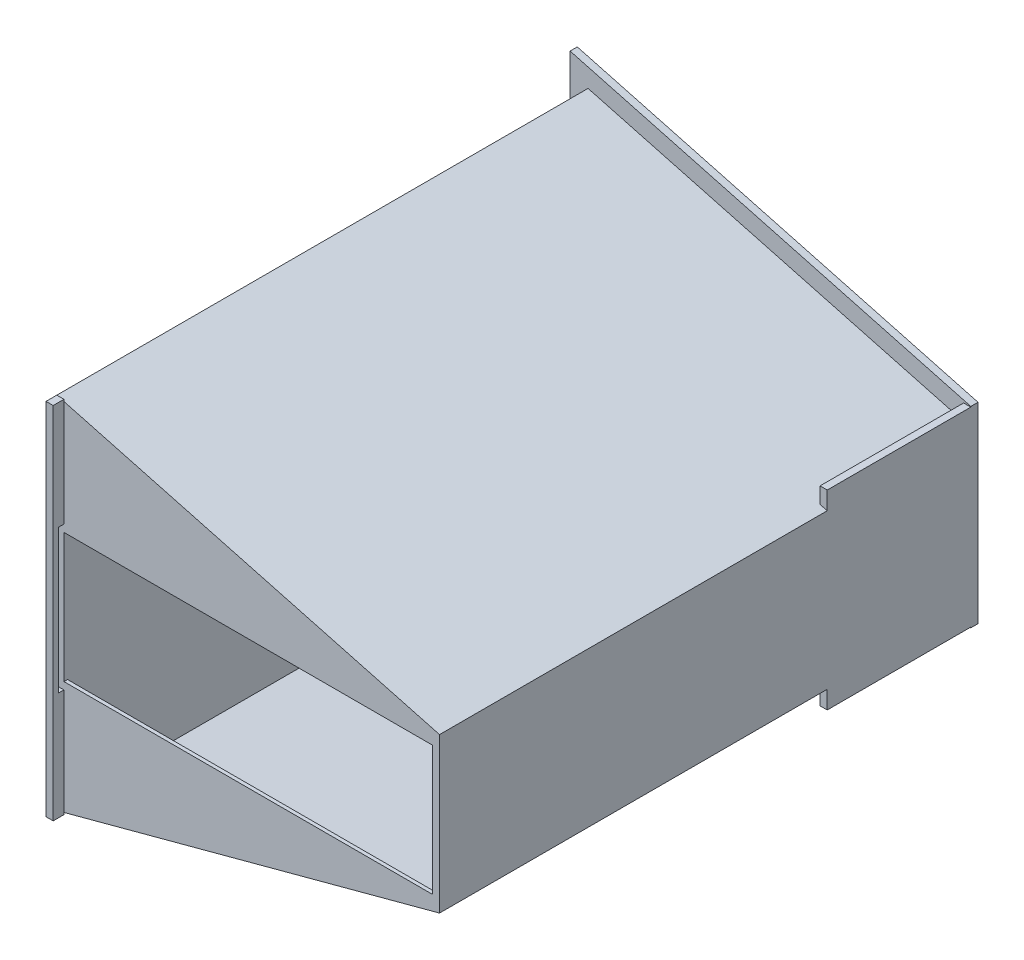
ISO-10303-21;
HEADER;
FILE_DESCRIPTION(('STEP AP214'),'2;1');
FILE_NAME('part.step','',(''),(''),'','','');
FILE_SCHEMA(('AUTOMOTIVE_DESIGN { 1 0 10303 214 1 1 1 1 }'));
ENDSEC;
DATA;
#1=APPLICATION_CONTEXT('core data for automotive mechanical design processes');
#2=APPLICATION_PROTOCOL_DEFINITION('international standard','automotive_design',2000,#1);
#3=PRODUCT_CONTEXT('',#1,'mechanical');
#4=PRODUCT('Part','Part','',(#3));
#5=PRODUCT_RELATED_PRODUCT_CATEGORY('part','',(#4));
#6=PRODUCT_DEFINITION_FORMATION('','',#4);
#7=PRODUCT_DEFINITION_CONTEXT('part definition',#1,'design');
#8=PRODUCT_DEFINITION('design','',#6,#7);
#9=PRODUCT_DEFINITION_SHAPE('','',#8);
#10=(LENGTH_UNIT() NAMED_UNIT(*) SI_UNIT(.MILLI.,.METRE.));
#11=(NAMED_UNIT(*) PLANE_ANGLE_UNIT() SI_UNIT($,.RADIAN.));
#12=(NAMED_UNIT(*) SI_UNIT($,.STERADIAN.) SOLID_ANGLE_UNIT());
#13=UNCERTAINTY_MEASURE_WITH_UNIT(LENGTH_MEASURE(1.E-05),#10,'distance_accuracy_value','');
#14=(GEOMETRIC_REPRESENTATION_CONTEXT(3) GLOBAL_UNCERTAINTY_ASSIGNED_CONTEXT((#13)) GLOBAL_UNIT_ASSIGNED_CONTEXT((#10,
#11,#12)) REPRESENTATION_CONTEXT('',''));
#15=CARTESIAN_POINT('',(0.,0.,0.));
#16=DIRECTION('',(0.,0.,1.));
#17=DIRECTION('',(1.,0.,0.));
#18=AXIS2_PLACEMENT_3D('',#15,#16,#17);
#19=CARTESIAN_POINT('',(24.2679246792882,90.5678949031037,150.));
#20=DIRECTION('',(-0.258822332634395,-0.965924945391561,0.));
#21=DIRECTION('',(0.965924945391561,-0.258822332634395,0.));
#22=AXIS2_PLACEMENT_3D('',#19,#20,#21);
#23=PLANE('',#22);
#24=DIRECTION('',(0.,0.,-1.));
#25=VECTOR('',#24,1.);
#26=CARTESIAN_POINT('',(104.63,69.0346485685079,150.));
#27=LINE('',#26,#25);
#28=CARTESIAN_POINT('',(104.63,69.0346485685079,150.));
#29=VERTEX_POINT('',#28);
#30=CARTESIAN_POINT('',(104.63,69.0346485685079,42.));
#31=VERTEX_POINT('',#30);
#32=EDGE_CURVE('E452',#29,#31,#27,.T.);
#33=ORIENTED_EDGE('',*,*,#32,.T.);
#34=DIRECTION('',(-0.965924945391561,0.258822332634395,0.));
#35=VECTOR('',#34,1.);
#36=CARTESIAN_POINT('',(24.2679246792883,90.5678949031037,42.));
#37=LINE('',#36,#35);
#38=CARTESIAN_POINT('',(102.63,69.5705542491081,42.));
#39=VERTEX_POINT('',#38);
#40=EDGE_CURVE('E286',#31,#39,#37,.T.);
#41=ORIENTED_EDGE('',*,*,#40,.T.);
#42=DIRECTION('',(0.,0.,-1.));
#43=VECTOR('',#42,1.);
#44=CARTESIAN_POINT('',(102.63,69.5705542491081,150.));
#45=LINE('',#44,#43);
#46=CARTESIAN_POINT('',(102.63,69.5705542491081,2.));
#47=VERTEX_POINT('',#46);
#48=EDGE_CURVE('E282',#39,#47,#45,.T.);
#49=ORIENTED_EDGE('',*,*,#48,.T.);
#50=DIRECTION('',(-0.965924945391561,0.258822332634395,0.));
#51=VECTOR('',#50,1.);
#52=CARTESIAN_POINT('',(-2.00000000000001,97.6064599297083,2.));
#53=LINE('',#52,#51);
#54=CARTESIAN_POINT('',(-2.00000000000001,97.6064599297083,2.));
#55=VERTEX_POINT('',#54);
#56=EDGE_CURVE('E58',#47,#55,#53,.T.);
#57=ORIENTED_EDGE('',*,*,#56,.T.);
#58=DIRECTION('',(0.,0.,-1.));
#59=VECTOR('',#58,1.);
#60=CARTESIAN_POINT('',(-2.00000000000001,97.6064599297083,150.));
#61=LINE('',#60,#59);
#62=CARTESIAN_POINT('',(-2.00000000000001,97.6064599297083,150.));
#63=VERTEX_POINT('',#62);
#64=EDGE_CURVE('E450',#63,#55,#61,.T.);
#65=ORIENTED_EDGE('',*,*,#64,.F.);
#66=DIRECTION('',(0.965924945391561,-0.258822332634395,0.));
#67=VECTOR('',#66,1.);
#68=CARTESIAN_POINT('',(24.2679246792882,90.5678949031037,150.));
#69=LINE('',#68,#67);
#70=CARTESIAN_POINT('',(0.,97.0705542491081,150.));
#71=VERTEX_POINT('',#70);
#72=EDGE_CURVE('E374',#63,#71,#69,.T.);
#73=ORIENTED_EDGE('',*,*,#72,.T.);
#74=DIRECTION('',(-0.965924945391561,0.258822332634395,0.));
#75=VECTOR('',#74,1.);
#76=CARTESIAN_POINT('',(24.2679246792882,90.5678949031037,150.));
#77=LINE('',#76,#75);
#78=EDGE_CURVE('E421',#29,#71,#77,.T.);
#79=ORIENTED_EDGE('',*,*,#78,.F.);
#80=EDGE_LOOP('',(#33,#41,#49,#57,#65,#73,#79));
#81=FACE_BOUND('',#80,.T.);
#82=ADVANCED_FACE('F35',(#81),#23,.F.);
#83=CARTESIAN_POINT('',(-1.99999999999999,0.,150.));
#84=DIRECTION('',(1.,0.,0.));
#85=DIRECTION('',(0.,1.,0.));
#86=AXIS2_PLACEMENT_3D('',#83,#84,#85);
#87=PLANE('',#86);
#88=DIRECTION('',(0.,0.,-1.));
#89=VECTOR('',#88,1.);
#90=CARTESIAN_POINT('',(-1.99999999999999,27.5,151.5));
#91=LINE('',#90,#89);
#92=CARTESIAN_POINT('',(-1.99999999999999,27.5,151.5));
#93=VERTEX_POINT('',#92);
#94=CARTESIAN_POINT('',(-2.,27.5,150.));
#95=VERTEX_POINT('',#94);
#96=EDGE_CURVE('E368',#93,#95,#91,.T.);
#97=ORIENTED_EDGE('',*,*,#96,.T.);
#98=DIRECTION('',(0.,-1.,0.));
#99=VECTOR('',#98,1.);
#100=CARTESIAN_POINT('',(-1.99999999999999,0.,150.));
#101=LINE('',#100,#99);
#102=CARTESIAN_POINT('',(-1.99999999999999,67.5,150.));
#103=VERTEX_POINT('',#102);
#104=EDGE_CURVE('E424',#103,#95,#101,.T.);
#105=ORIENTED_EDGE('',*,*,#104,.F.);
#106=DIRECTION('',(0.,0.,1.));
#107=VECTOR('',#106,1.);
#108=CARTESIAN_POINT('',(-1.99999999999999,67.5,150.));
#109=LINE('',#108,#107);
#110=CARTESIAN_POINT('',(-1.99999999999999,67.5,151.5));
#111=VERTEX_POINT('',#110);
#112=EDGE_CURVE('E362',#103,#111,#109,.T.);
#113=ORIENTED_EDGE('',*,*,#112,.T.);
#114=DIRECTION('',(0.,-1.,0.));
#115=VECTOR('',#114,1.);
#116=CARTESIAN_POINT('',(-1.99999999999999,67.5,151.5));
#117=LINE('',#116,#115);
#118=EDGE_CURVE('E365',#111,#93,#117,.T.);
#119=ORIENTED_EDGE('',*,*,#118,.T.);
#120=EDGE_LOOP('',(#97,#105,#113,#119));
#121=FACE_BOUND('',#120,.T.);
#122=DIRECTION('',(0.,-1.,0.));
#123=VECTOR('',#122,1.);
#124=CARTESIAN_POINT('',(-1.99999999999999,-2.60645992970831,2.));
#125=LINE('',#124,#123);
#126=CARTESIAN_POINT('',(-1.99999999999999,-2.60645992970831,2.));
#127=VERTEX_POINT('',#126);
#128=EDGE_CURVE('E291',#55,#127,#125,.T.);
#129=ORIENTED_EDGE('',*,*,#128,.T.);
#130=DIRECTION('',(0.,0.,-1.));
#131=VECTOR('',#130,1.);
#132=CARTESIAN_POINT('',(-1.99999999999999,-2.60645992970831,150.));
#133=LINE('',#132,#131);
#134=CARTESIAN_POINT('',(-1.99999999999999,-2.60645992970831,150.));
#135=VERTEX_POINT('',#134);
#136=EDGE_CURVE('E446',#135,#127,#133,.T.);
#137=ORIENTED_EDGE('',*,*,#136,.F.);
#138=DIRECTION('',(0.,0.,1.));
#139=VECTOR('',#138,1.);
#140=CARTESIAN_POINT('',(-1.99999999999999,-2.60645992970831,150.));
#141=LINE('',#140,#139);
#142=CARTESIAN_POINT('',(-1.99999999999999,-2.60645992970831,153.));
#143=VERTEX_POINT('',#142);
#144=EDGE_CURVE('E320',#135,#143,#141,.T.);
#145=ORIENTED_EDGE('',*,*,#144,.T.);
#146=DIRECTION('',(0.,1.,0.));
#147=VECTOR('',#146,1.);
#148=CARTESIAN_POINT('',(-1.99999999999999,-2.60645992970831,153.));
#149=LINE('',#148,#147);
#150=CARTESIAN_POINT('',(-1.99999999999999,97.6064599297083,153.));
#151=VERTEX_POINT('',#150);
#152=EDGE_CURVE('E356',#143,#151,#149,.T.);
#153=ORIENTED_EDGE('',*,*,#152,.T.);
#154=DIRECTION('',(0.,0.,-1.));
#155=VECTOR('',#154,1.);
#156=CARTESIAN_POINT('',(-1.99999999999999,97.6064599297083,153.));
#157=LINE('',#156,#155);
#158=EDGE_CURVE('E359',#151,#63,#157,.T.);
#159=ORIENTED_EDGE('',*,*,#158,.T.);
#160=ORIENTED_EDGE('',*,*,#64,.T.);
#161=EDGE_LOOP('',(#129,#137,#145,#153,#159,#160));
#162=FACE_BOUND('',#161,.T.);
#163=ADVANCED_FACE('F521',(#121,#162),#87,.F.);
#164=CARTESIAN_POINT('',(0.51764466526879,-1.93184989078312,150.));
#165=DIRECTION('',(-0.258822332634395,0.965924945391561,0.));
#166=DIRECTION('',(-0.965924945391561,-0.258822332634395,0.));
#167=AXIS2_PLACEMENT_3D('',#164,#165,#166);
#168=PLANE('',#167);
#169=DIRECTION('',(0.,0.,-1.));
#170=VECTOR('',#169,1.);
#171=CARTESIAN_POINT('',(102.63,25.4294457508919,150.));
#172=LINE('',#171,#170);
#173=CARTESIAN_POINT('',(102.63,25.4294457508919,42.));
#174=VERTEX_POINT('',#173);
#175=CARTESIAN_POINT('',(102.63,25.4294457508919,2.));
#176=VERTEX_POINT('',#175);
#177=EDGE_CURVE('E240',#174,#176,#172,.T.);
#178=ORIENTED_EDGE('',*,*,#177,.F.);
#179=DIRECTION('',(0.965924945391561,0.258822332634395,0.));
#180=VECTOR('',#179,1.);
#181=CARTESIAN_POINT('',(0.517644665268827,-1.93184989078311,42.));
#182=LINE('',#181,#180);
#183=CARTESIAN_POINT('',(104.63,25.9653514314921,42.));
#184=VERTEX_POINT('',#183);
#185=EDGE_CURVE('E264',#174,#184,#182,.T.);
#186=ORIENTED_EDGE('',*,*,#185,.T.);
#187=DIRECTION('',(0.,0.,-1.));
#188=VECTOR('',#187,1.);
#189=CARTESIAN_POINT('',(104.63,25.9653514314921,150.));
#190=LINE('',#189,#188);
#191=CARTESIAN_POINT('',(104.63,25.9653514314921,150.));
#192=VERTEX_POINT('',#191);
#193=EDGE_CURVE('E443',#192,#184,#190,.T.);
#194=ORIENTED_EDGE('',*,*,#193,.F.);
#195=DIRECTION('',(0.965924945391561,0.258822332634395,0.));
#196=VECTOR('',#195,1.);
#197=CARTESIAN_POINT('',(0.51764466526879,-1.93184989078312,150.));
#198=LINE('',#197,#196);
#199=CARTESIAN_POINT('',(0.,-2.07055424910809,150.));
#200=VERTEX_POINT('',#199);
#201=EDGE_CURVE('E426',#200,#192,#198,.T.);
#202=ORIENTED_EDGE('',*,*,#201,.F.);
#203=EDGE_CURVE('E427',#135,#200,#198,.T.);
#204=ORIENTED_EDGE('',*,*,#203,.F.);
#205=ORIENTED_EDGE('',*,*,#136,.T.);
#206=DIRECTION('',(0.965924945391561,0.258822332634395,0.));
#207=VECTOR('',#206,1.);
#208=CARTESIAN_POINT('',(104.63,25.9653514314921,2.));
#209=LINE('',#208,#207);
#210=EDGE_CURVE('E294',#127,#176,#209,.T.);
#211=ORIENTED_EDGE('',*,*,#210,.T.);
#212=EDGE_LOOP('',(#178,#186,#194,#202,#204,#205,#211));
#213=FACE_BOUND('',#212,.T.);
#214=ADVANCED_FACE('F514',(#213),#168,.F.);
#215=CARTESIAN_POINT('',(102.63,0.,150.));
#216=DIRECTION('',(-1.,0.,0.));
#217=DIRECTION('',(0.,0.,1.));
#218=AXIS2_PLACEMENT_3D('',#215,#216,#217);
#219=PLANE('',#218);
#220=DIRECTION('',(0.,-1.,0.));
#221=VECTOR('',#220,1.);
#222=CARTESIAN_POINT('',(102.63,0.,149.));
#223=LINE('',#222,#221);
#224=CARTESIAN_POINT('',(102.63,29.5,149.));
#225=VERTEX_POINT('',#224);
#226=CARTESIAN_POINT('',(102.63,27.5,149.));
#227=VERTEX_POINT('',#226);
#228=EDGE_CURVE('E402',#225,#227,#223,.T.);
#229=ORIENTED_EDGE('',*,*,#228,.F.);
#230=DIRECTION('',(0.,0.,1.));
#231=VECTOR('',#230,1.);
#232=CARTESIAN_POINT('',(102.63,29.5,149.));
#233=LINE('',#232,#231);
#234=CARTESIAN_POINT('',(102.63,29.5,150.));
#235=VERTEX_POINT('',#234);
#236=EDGE_CURVE('E408',#225,#235,#233,.T.);
#237=ORIENTED_EDGE('',*,*,#236,.T.);
#238=DIRECTION('',(0.,1.,0.));
#239=VECTOR('',#238,1.);
#240=CARTESIAN_POINT('',(102.63,0.,150.));
#241=LINE('',#240,#239);
#242=CARTESIAN_POINT('',(102.63,65.5,150.));
#243=VERTEX_POINT('',#242);
#244=EDGE_CURVE('E413',#235,#243,#241,.T.);
#245=ORIENTED_EDGE('',*,*,#244,.T.);
#246=DIRECTION('',(0.,0.,1.));
#247=VECTOR('',#246,1.);
#248=CARTESIAN_POINT('',(102.63,65.5,149.));
#249=LINE('',#248,#247);
#250=CARTESIAN_POINT('',(102.63,65.5,149.));
#251=VERTEX_POINT('',#250);
#252=EDGE_CURVE('E470',#251,#243,#249,.T.);
#253=ORIENTED_EDGE('',*,*,#252,.F.);
#254=DIRECTION('',(0.,-1.,0.));
#255=VECTOR('',#254,1.);
#256=CARTESIAN_POINT('',(102.63,0.,149.));
#257=LINE('',#256,#255);
#258=CARTESIAN_POINT('',(102.63,67.5,149.));
#259=VERTEX_POINT('',#258);
#260=EDGE_CURVE('E464',#259,#251,#257,.T.);
#261=ORIENTED_EDGE('',*,*,#260,.F.);
#262=DIRECTION('',(0.,0.,-1.));
#263=VECTOR('',#262,1.);
#264=CARTESIAN_POINT('',(102.63,67.5,150.));
#265=LINE('',#264,#263);
#266=CARTESIAN_POINT('',(102.63,67.5,0.));
#267=VERTEX_POINT('',#266);
#268=EDGE_CURVE('E447',#259,#267,#265,.T.);
#269=ORIENTED_EDGE('',*,*,#268,.T.);
#270=DIRECTION('',(0.,1.,0.));
#271=VECTOR('',#270,1.);
#272=CARTESIAN_POINT('',(102.63,0.,0.));
#273=LINE('',#272,#271);
#274=CARTESIAN_POINT('',(102.63,27.5,0.));
#275=VERTEX_POINT('',#274);
#276=EDGE_CURVE('E433',#275,#267,#273,.T.);
#277=ORIENTED_EDGE('',*,*,#276,.F.);
#278=DIRECTION('',(0.,0.,-1.));
#279=VECTOR('',#278,1.);
#280=CARTESIAN_POINT('',(102.63,27.5,150.));
#281=LINE('',#280,#279);
#282=EDGE_CURVE('E459',#227,#275,#281,.T.);
#283=ORIENTED_EDGE('',*,*,#282,.F.);
#284=EDGE_LOOP('',(#229,#237,#245,#253,#261,#269,#277,#283));
#285=FACE_BOUND('',#284,.T.);
#286=ADVANCED_FACE('F512',(#285),#219,.T.);
#287=CARTESIAN_POINT('',(0.,0.,150.));
#288=DIRECTION('',(1.,0.,0.));
#289=DIRECTION('',(0.,0.,-1.));
#290=AXIS2_PLACEMENT_3D('',#287,#288,#289);
#291=PLANE('',#290);
#292=DIRECTION('',(0.,-1.,0.));
#293=VECTOR('',#292,1.);
#294=CARTESIAN_POINT('',(0.,0.,150.));
#295=LINE('',#294,#293);
#296=CARTESIAN_POINT('',(0.,65.5,150.));
#297=VERTEX_POINT('',#296);
#298=CARTESIAN_POINT('',(0.,29.5,150.));
#299=VERTEX_POINT('',#298);
#300=EDGE_CURVE('E415',#297,#299,#295,.T.);
#301=ORIENTED_EDGE('',*,*,#300,.T.);
#302=DIRECTION('',(0.,0.,1.));
#303=VECTOR('',#302,1.);
#304=CARTESIAN_POINT('',(0.,29.5,149.));
#305=LINE('',#304,#303);
#306=CARTESIAN_POINT('',(0.,29.5,149.));
#307=VERTEX_POINT('',#306);
#308=EDGE_CURVE('E405',#307,#299,#305,.T.);
#309=ORIENTED_EDGE('',*,*,#308,.F.);
#310=DIRECTION('',(0.,1.,0.));
#311=VECTOR('',#310,1.);
#312=CARTESIAN_POINT('',(0.,0.,149.));
#313=LINE('',#312,#311);
#314=CARTESIAN_POINT('',(0.,0.,149.));
#315=VERTEX_POINT('',#314);
#316=EDGE_CURVE('E396',#315,#307,#313,.T.);
#317=ORIENTED_EDGE('',*,*,#316,.F.);
#318=DIRECTION('',(0.,0.,-1.));
#319=VECTOR('',#318,1.);
#320=CARTESIAN_POINT('',(0.,0.,150.));
#321=LINE('',#320,#319);
#322=CARTESIAN_POINT('',(0.,0.,0.));
#323=VERTEX_POINT('',#322);
#324=EDGE_CURVE('E457',#315,#323,#321,.T.);
#325=ORIENTED_EDGE('',*,*,#324,.T.);
#326=DIRECTION('',(0.,-1.,0.));
#327=VECTOR('',#326,1.);
#328=CARTESIAN_POINT('',(0.,0.,0.));
#329=LINE('',#328,#327);
#330=CARTESIAN_POINT('',(0.,95.,0.));
#331=VERTEX_POINT('',#330);
#332=EDGE_CURVE('E439',#331,#323,#329,.T.);
#333=ORIENTED_EDGE('',*,*,#332,.F.);
#334=DIRECTION('',(0.,0.,-1.));
#335=VECTOR('',#334,1.);
#336=CARTESIAN_POINT('',(0.,95.,150.));
#337=LINE('',#336,#335);
#338=CARTESIAN_POINT('',(0.,95.,149.));
#339=VERTEX_POINT('',#338);
#340=EDGE_CURVE('E430',#339,#331,#337,.T.);
#341=ORIENTED_EDGE('',*,*,#340,.F.);
#342=DIRECTION('',(0.,1.,0.));
#343=VECTOR('',#342,1.);
#344=CARTESIAN_POINT('',(0.,0.,149.));
#345=LINE('',#344,#343);
#346=CARTESIAN_POINT('',(0.,65.5,149.));
#347=VERTEX_POINT('',#346);
#348=EDGE_CURVE('E468',#347,#339,#345,.T.);
#349=ORIENTED_EDGE('',*,*,#348,.F.);
#350=DIRECTION('',(0.,0.,1.));
#351=VECTOR('',#350,1.);
#352=CARTESIAN_POINT('',(0.,65.5,149.));
#353=LINE('',#352,#351);
#354=EDGE_CURVE('E43',#347,#297,#353,.T.);
#355=ORIENTED_EDGE('',*,*,#354,.T.);
#356=EDGE_LOOP('',(#301,#309,#317,#325,#333,#341,#349,#355));
#357=FACE_BOUND('',#356,.T.);
#358=ADVANCED_FACE('F487',(#357),#291,.T.);
#359=CARTESIAN_POINT('',(0.,0.,150.));
#360=DIRECTION('',(-0.258822332634395,0.965924945391561,0.));
#361=DIRECTION('',(-0.965924945391561,-0.258822332634395,0.));
#362=AXIS2_PLACEMENT_3D('',#359,#360,#361);
#363=PLANE('',#362);
#364=ORIENTED_EDGE('',*,*,#324,.F.);
#365=DIRECTION('',(-0.965924945391561,-0.258822332634395,0.));
#366=VECTOR('',#365,1.);
#367=CARTESIAN_POINT('',(0.,0.,149.));
#368=LINE('',#367,#366);
#369=EDGE_CURVE('E399',#227,#315,#368,.T.);
#370=ORIENTED_EDGE('',*,*,#369,.F.);
#371=ORIENTED_EDGE('',*,*,#282,.T.);
#372=DIRECTION('',(0.965924945391561,0.258822332634395,0.));
#373=VECTOR('',#372,1.);
#374=CARTESIAN_POINT('',(0.,0.,0.));
#375=LINE('',#374,#373);
#376=EDGE_CURVE('E436',#323,#275,#375,.T.);
#377=ORIENTED_EDGE('',*,*,#376,.F.);
#378=EDGE_LOOP('',(#364,#370,#371,#377));
#379=FACE_BOUND('',#378,.T.);
#380=ADVANCED_FACE('F499',(#379),#363,.T.);
#381=CARTESIAN_POINT('',(0.,65.5,149.));
#382=DIRECTION('',(0.,1.,0.));
#383=DIRECTION('',(-1.,0.,0.));
#384=AXIS2_PLACEMENT_3D('',#381,#382,#383);
#385=PLANE('',#384);
#386=DIRECTION('',(-1.,0.,0.));
#387=VECTOR('',#386,1.);
#388=CARTESIAN_POINT('',(0.,65.5,150.));
#389=LINE('',#388,#387);
#390=EDGE_CURVE('E455',#243,#297,#389,.T.);
#391=ORIENTED_EDGE('',*,*,#390,.T.);
#392=ORIENTED_EDGE('',*,*,#354,.F.);
#393=DIRECTION('',(-1.,0.,0.));
#394=VECTOR('',#393,1.);
#395=CARTESIAN_POINT('',(0.,65.5,149.));
#396=LINE('',#395,#394);
#397=EDGE_CURVE('E462',#251,#347,#396,.T.);
#398=ORIENTED_EDGE('',*,*,#397,.F.);
#399=ORIENTED_EDGE('',*,*,#252,.T.);
#400=EDGE_LOOP('',(#391,#392,#398,#399));
#401=FACE_BOUND('',#400,.T.);
#402=ADVANCED_FACE('F37',(#401),#385,.F.);
#403=CARTESIAN_POINT('',(0.,0.,149.));
#404=DIRECTION('',(0.,0.,1.));
#405=DIRECTION('',(1.,0.,0.));
#406=AXIS2_PLACEMENT_3D('',#403,#404,#405);
#407=PLANE('',#406);
#408=ORIENTED_EDGE('',*,*,#397,.T.);
#409=ORIENTED_EDGE('',*,*,#348,.T.);
#410=DIRECTION('',(0.965924945391561,-0.258822332634395,0.));
#411=VECTOR('',#410,1.);
#412=CARTESIAN_POINT('',(23.7502800140195,88.6360450123206,149.));
#413=LINE('',#412,#411);
#414=EDGE_CURVE('E466',#339,#259,#413,.T.);
#415=ORIENTED_EDGE('',*,*,#414,.T.);
#416=ORIENTED_EDGE('',*,*,#260,.T.);
#417=EDGE_LOOP('',(#408,#409,#415,#416));
#418=FACE_BOUND('',#417,.T.);
#419=ADVANCED_FACE('F511',(#418),#407,.F.);
#420=CARTESIAN_POINT('',(0.,0.,150.));
#421=DIRECTION('',(0.,0.,1.));
#422=DIRECTION('',(1.,0.,0.));
#423=AXIS2_PLACEMENT_3D('',#420,#421,#422);
#424=PLANE('',#423);
#425=DIRECTION('',(-1.,0.,0.));
#426=VECTOR('',#425,1.);
#427=CARTESIAN_POINT('',(0.,67.5,150.));
#428=LINE('',#427,#426);
#429=CARTESIAN_POINT('',(0.,67.5,150.));
#430=VERTEX_POINT('',#429);
#431=EDGE_CURVE('E379',#430,#103,#428,.T.);
#432=ORIENTED_EDGE('',*,*,#431,.T.);
#433=ORIENTED_EDGE('',*,*,#104,.T.);
#434=DIRECTION('',(-1.,0.,0.));
#435=VECTOR('',#434,1.);
#436=CARTESIAN_POINT('',(0.,27.5,150.));
#437=LINE('',#436,#435);
#438=CARTESIAN_POINT('',(0.,27.5,150.));
#439=VERTEX_POINT('',#438);
#440=EDGE_CURVE('E371',#439,#95,#437,.T.);
#441=ORIENTED_EDGE('',*,*,#440,.F.);
#442=DIRECTION('',(0.,-1.,0.));
#443=VECTOR('',#442,1.);
#444=CARTESIAN_POINT('',(0.,27.5,150.));
#445=LINE('',#444,#443);
#446=EDGE_CURVE('E327',#439,#200,#445,.T.);
#447=ORIENTED_EDGE('',*,*,#446,.T.);
#448=ORIENTED_EDGE('',*,*,#201,.T.);
#449=DIRECTION('',(0.,1.,0.));
#450=VECTOR('',#449,1.);
#451=CARTESIAN_POINT('',(104.63,0.,150.));
#452=LINE('',#451,#450);
#453=EDGE_CURVE('E418',#192,#29,#452,.T.);
#454=ORIENTED_EDGE('',*,*,#453,.T.);
#455=ORIENTED_EDGE('',*,*,#78,.T.);
#456=DIRECTION('',(0.,-1.,0.));
#457=VECTOR('',#456,1.);
#458=CARTESIAN_POINT('',(0.,97.6064599297083,150.));
#459=LINE('',#458,#457);
#460=EDGE_CURVE('E340',#71,#430,#459,.T.);
#461=ORIENTED_EDGE('',*,*,#460,.T.);
#462=EDGE_LOOP('',(#432,#433,#441,#447,#448,#454,#455,#461));
#463=FACE_BOUND('',#462,.T.);
#464=ORIENTED_EDGE('',*,*,#244,.F.);
#465=DIRECTION('',(1.,0.,0.));
#466=VECTOR('',#465,1.);
#467=CARTESIAN_POINT('',(0.,29.5,150.));
#468=LINE('',#467,#466);
#469=EDGE_CURVE('E392',#299,#235,#468,.T.);
#470=ORIENTED_EDGE('',*,*,#469,.F.);
#471=ORIENTED_EDGE('',*,*,#300,.F.);
#472=ORIENTED_EDGE('',*,*,#390,.F.);
#473=EDGE_LOOP('',(#464,#470,#471,#472));
#474=FACE_BOUND('',#473,.T.);
#475=ADVANCED_FACE('F484',(#463,#474),#424,.T.);
#476=CARTESIAN_POINT('',(23.7502800140195,88.6360450123206,150.));
#477=DIRECTION('',(-0.258822332634395,-0.965924945391561,0.));
#478=DIRECTION('',(0.965924945391561,-0.258822332634395,0.));
#479=AXIS2_PLACEMENT_3D('',#476,#477,#478);
#480=PLANE('',#479);
#481=ORIENTED_EDGE('',*,*,#414,.F.);
#482=ORIENTED_EDGE('',*,*,#340,.T.);
#483=DIRECTION('',(-0.965924945391561,0.258822332634395,0.));
#484=VECTOR('',#483,1.);
#485=CARTESIAN_POINT('',(23.7502800140195,88.6360450123206,0.));
#486=LINE('',#485,#484);
#487=EDGE_CURVE('E410',#267,#331,#486,.T.);
#488=ORIENTED_EDGE('',*,*,#487,.F.);
#489=ORIENTED_EDGE('',*,*,#268,.F.);
#490=EDGE_LOOP('',(#481,#482,#488,#489));
#491=FACE_BOUND('',#490,.T.);
#492=ADVANCED_FACE('F508',(#491),#480,.T.);
#493=CARTESIAN_POINT('',(104.63,0.,150.));
#494=DIRECTION('',(-1.,0.,0.));
#495=DIRECTION('',(0.,0.,1.));
#496=AXIS2_PLACEMENT_3D('',#493,#494,#495);
#497=PLANE('',#496);
#498=ORIENTED_EDGE('',*,*,#193,.T.);
#499=DIRECTION('',(0.,-1.,0.));
#500=VECTOR('',#499,1.);
#501=CARTESIAN_POINT('',(104.63,25.9653514314921,42.));
#502=LINE('',#501,#500);
#503=CARTESIAN_POINT('',(104.63,20.9653514314921,42.));
#504=VERTEX_POINT('',#503);
#505=EDGE_CURVE('E253',#184,#504,#502,.T.);
#506=ORIENTED_EDGE('',*,*,#505,.T.);
#507=DIRECTION('',(0.,0.,-1.));
#508=VECTOR('',#507,1.);
#509=CARTESIAN_POINT('',(104.63,20.9653514314921,42.));
#510=LINE('',#509,#508);
#511=CARTESIAN_POINT('',(104.63,20.9653514314921,2.));
#512=VERTEX_POINT('',#511);
#513=EDGE_CURVE('E50',#504,#512,#510,.T.);
#514=ORIENTED_EDGE('',*,*,#513,.T.);
#515=DIRECTION('',(0.,-1.,0.));
#516=VECTOR('',#515,1.);
#517=CARTESIAN_POINT('',(104.63,25.9653514314921,2.));
#518=LINE('',#517,#516);
#519=CARTESIAN_POINT('',(104.63,20.7889658087219,2.));
#520=VERTEX_POINT('',#519);
#521=EDGE_CURVE('E257',#512,#520,#518,.T.);
#522=ORIENTED_EDGE('',*,*,#521,.T.);
#523=DIRECTION('',(0.,0.,-1.));
#524=VECTOR('',#523,1.);
#525=CARTESIAN_POINT('',(104.63,20.7889658087219,2.));
#526=LINE('',#525,#524);
#527=CARTESIAN_POINT('',(104.63,20.7889658087219,0.));
#528=VERTEX_POINT('',#527);
#529=EDGE_CURVE('E309',#520,#528,#526,.T.);
#530=ORIENTED_EDGE('',*,*,#529,.T.);
#531=DIRECTION('',(0.,1.,0.));
#532=VECTOR('',#531,1.);
#533=CARTESIAN_POINT('',(104.63,0.,0.));
#534=LINE('',#533,#532);
#535=CARTESIAN_POINT('',(104.63,74.2110341912781,0.));
#536=VERTEX_POINT('',#535);
#537=EDGE_CURVE('E416',#528,#536,#534,.T.);
#538=ORIENTED_EDGE('',*,*,#537,.T.);
#539=DIRECTION('',(0.,0.,-1.));
#540=VECTOR('',#539,1.);
#541=CARTESIAN_POINT('',(104.63,74.2110341912781,2.));
#542=LINE('',#541,#540);
#543=CARTESIAN_POINT('',(104.63,74.2110341912781,2.));
#544=VERTEX_POINT('',#543);
#545=EDGE_CURVE('E317',#544,#536,#542,.T.);
#546=ORIENTED_EDGE('',*,*,#545,.F.);
#547=DIRECTION('',(0.,-1.,0.));
#548=VECTOR('',#547,1.);
#549=CARTESIAN_POINT('',(104.63,74.2110341912781,2.));
#550=LINE('',#549,#548);
#551=CARTESIAN_POINT('',(104.63,74.0346485685079,2.));
#552=VERTEX_POINT('',#551);
#553=EDGE_CURVE('E306',#544,#552,#550,.T.);
#554=ORIENTED_EDGE('',*,*,#553,.T.);
#555=DIRECTION('',(0.,0.,1.));
#556=VECTOR('',#555,1.);
#557=CARTESIAN_POINT('',(104.63,74.0346485685079,42.));
#558=LINE('',#557,#556);
#559=CARTESIAN_POINT('',(104.63,74.0346485685079,42.));
#560=VERTEX_POINT('',#559);
#561=EDGE_CURVE('E267',#552,#560,#558,.T.);
#562=ORIENTED_EDGE('',*,*,#561,.T.);
#563=DIRECTION('',(0.,-1.,0.));
#564=VECTOR('',#563,1.);
#565=CARTESIAN_POINT('',(104.63,69.0346485685079,42.));
#566=LINE('',#565,#564);
#567=EDGE_CURVE('E272',#560,#31,#566,.T.);
#568=ORIENTED_EDGE('',*,*,#567,.T.);
#569=ORIENTED_EDGE('',*,*,#32,.F.);
#570=ORIENTED_EDGE('',*,*,#453,.F.);
#571=EDGE_LOOP('',(#498,#506,#514,#522,#530,#538,#546,#554,#562,#568,#569,#570));
#572=FACE_BOUND('',#571,.T.);
#573=ADVANCED_FACE('F534',(#572),#497,.F.);
#574=CARTESIAN_POINT('',(0.,0.,0.));
#575=DIRECTION('',(0.,0.,1.));
#576=DIRECTION('',(1.,0.,0.));
#577=AXIS2_PLACEMENT_3D('',#574,#575,#576);
#578=PLANE('',#577);
#579=ORIENTED_EDGE('',*,*,#537,.F.);
#580=DIRECTION('',(-0.965924945391561,-0.258822332634395,0.));
#581=VECTOR('',#580,1.);
#582=CARTESIAN_POINT('',(104.63,20.7889658087219,0.));
#583=LINE('',#582,#581);
#584=CARTESIAN_POINT('',(-6.99999999999999,-9.12260975397908,0.));
#585=VERTEX_POINT('',#584);
#586=EDGE_CURVE('E289',#528,#585,#583,.T.);
#587=ORIENTED_EDGE('',*,*,#586,.T.);
#588=DIRECTION('',(0.,1.,0.));
#589=VECTOR('',#588,1.);
#590=CARTESIAN_POINT('',(-6.99999999999999,-9.12260975397908,0.));
#591=LINE('',#590,#589);
#592=CARTESIAN_POINT('',(-6.99999999999999,104.122609753979,0.));
#593=VERTEX_POINT('',#592);
#594=EDGE_CURVE('E312',#585,#593,#591,.T.);
#595=ORIENTED_EDGE('',*,*,#594,.T.);
#596=DIRECTION('',(0.965924945391561,-0.258822332634395,0.));
#597=VECTOR('',#596,1.);
#598=CARTESIAN_POINT('',(-6.99999999999999,104.122609753979,0.));
#599=LINE('',#598,#597);
#600=EDGE_CURVE('E292',#593,#536,#599,.T.);
#601=ORIENTED_EDGE('',*,*,#600,.T.);
#602=EDGE_LOOP('',(#579,#587,#595,#601));
#603=FACE_BOUND('',#602,.T.);
#604=ORIENTED_EDGE('',*,*,#487,.T.);
#605=ORIENTED_EDGE('',*,*,#332,.T.);
#606=ORIENTED_EDGE('',*,*,#376,.T.);
#607=ORIENTED_EDGE('',*,*,#276,.T.);
#608=EDGE_LOOP('',(#604,#605,#606,#607));
#609=FACE_BOUND('',#608,.T.);
#610=ADVANCED_FACE('F503',(#603,#609),#578,.F.);
#611=CARTESIAN_POINT('',(0.,29.5,149.));
#612=DIRECTION('',(0.,-1.,0.));
#613=DIRECTION('',(0.,0.,-1.));
#614=AXIS2_PLACEMENT_3D('',#611,#612,#613);
#615=PLANE('',#614);
#616=ORIENTED_EDGE('',*,*,#469,.T.);
#617=ORIENTED_EDGE('',*,*,#236,.F.);
#618=DIRECTION('',(1.,0.,0.));
#619=VECTOR('',#618,1.);
#620=CARTESIAN_POINT('',(0.,29.5,149.));
#621=LINE('',#620,#619);
#622=EDGE_CURVE('E393',#307,#225,#621,.T.);
#623=ORIENTED_EDGE('',*,*,#622,.F.);
#624=ORIENTED_EDGE('',*,*,#308,.T.);
#625=EDGE_LOOP('',(#616,#617,#623,#624));
#626=FACE_BOUND('',#625,.T.);
#627=ADVANCED_FACE('F491',(#626),#615,.F.);
#628=CARTESIAN_POINT('',(0.,0.,149.));
#629=DIRECTION('',(0.,0.,1.));
#630=DIRECTION('',(1.,0.,0.));
#631=AXIS2_PLACEMENT_3D('',#628,#629,#630);
#632=PLANE('',#631);
#633=ORIENTED_EDGE('',*,*,#622,.T.);
#634=ORIENTED_EDGE('',*,*,#228,.T.);
#635=ORIENTED_EDGE('',*,*,#369,.T.);
#636=ORIENTED_EDGE('',*,*,#316,.T.);
#637=EDGE_LOOP('',(#633,#634,#635,#636));
#638=FACE_BOUND('',#637,.T.);
#639=ADVANCED_FACE('F494',(#638),#632,.F.);
#640=CARTESIAN_POINT('',(0.,97.6064599297083,150.));
#641=DIRECTION('',(0.,0.,-1.));
#642=DIRECTION('',(-1.,0.,0.));
#643=AXIS2_PLACEMENT_3D('',#640,#641,#642);
#644=PLANE('',#643);
#645=ORIENTED_EDGE('',*,*,#72,.F.);
#646=DIRECTION('',(-1.,0.,0.));
#647=VECTOR('',#646,1.);
#648=CARTESIAN_POINT('',(0.,97.6064599297083,150.));
#649=LINE('',#648,#647);
#650=CARTESIAN_POINT('',(0.,97.6064599297083,150.));
#651=VERTEX_POINT('',#650);
#652=EDGE_CURVE('E382',#651,#63,#649,.T.);
#653=ORIENTED_EDGE('',*,*,#652,.F.);
#654=EDGE_CURVE('E341',#651,#71,#459,.T.);
#655=ORIENTED_EDGE('',*,*,#654,.T.);
#656=EDGE_LOOP('',(#645,#653,#655));
#657=FACE_BOUND('',#656,.T.);
#658=ADVANCED_FACE('F580',(#657),#644,.T.);
#659=CARTESIAN_POINT('',(0.,27.5,150.));
#660=DIRECTION('',(0.,0.,-1.));
#661=DIRECTION('',(-1.,0.,0.));
#662=AXIS2_PLACEMENT_3D('',#659,#660,#661);
#663=PLANE('',#662);
#664=ORIENTED_EDGE('',*,*,#203,.T.);
#665=CARTESIAN_POINT('',(0.,-2.60645992970831,150.));
#666=VERTEX_POINT('',#665);
#667=EDGE_CURVE('E331',#200,#666,#445,.T.);
#668=ORIENTED_EDGE('',*,*,#667,.T.);
#669=DIRECTION('',(-1.,0.,0.));
#670=VECTOR('',#669,1.);
#671=CARTESIAN_POINT('',(0.,-2.60645992970831,150.));
#672=LINE('',#671,#670);
#673=EDGE_CURVE('E353',#666,#135,#672,.T.);
#674=ORIENTED_EDGE('',*,*,#673,.T.);
#675=EDGE_LOOP('',(#664,#668,#674));
#676=FACE_BOUND('',#675,.T.);
#677=ADVANCED_FACE('F587',(#676),#663,.T.);
#678=CARTESIAN_POINT('',(0.,27.5,151.5));
#679=DIRECTION('',(0.,1.,0.));
#680=DIRECTION('',(0.,0.,1.));
#681=AXIS2_PLACEMENT_3D('',#678,#679,#680);
#682=PLANE('',#681);
#683=ORIENTED_EDGE('',*,*,#96,.F.);
#684=DIRECTION('',(-1.,0.,0.));
#685=VECTOR('',#684,1.);
#686=CARTESIAN_POINT('',(0.,27.5,151.5));
#687=LINE('',#686,#685);
#688=CARTESIAN_POINT('',(0.,27.5,151.5));
#689=VERTEX_POINT('',#688);
#690=EDGE_CURVE('E375',#689,#93,#687,.T.);
#691=ORIENTED_EDGE('',*,*,#690,.F.);
#692=DIRECTION('',(0.,0.,-1.));
#693=VECTOR('',#692,1.);
#694=CARTESIAN_POINT('',(0.,27.5,151.5));
#695=LINE('',#694,#693);
#696=EDGE_CURVE('E350',#689,#439,#695,.T.);
#697=ORIENTED_EDGE('',*,*,#696,.T.);
#698=ORIENTED_EDGE('',*,*,#440,.T.);
#699=EDGE_LOOP('',(#683,#691,#697,#698));
#700=FACE_BOUND('',#699,.T.);
#701=ADVANCED_FACE('F595',(#700),#682,.T.);
#702=CARTESIAN_POINT('',(0.,67.5,151.5));
#703=DIRECTION('',(0.,0.,-1.));
#704=DIRECTION('',(-1.,0.,0.));
#705=AXIS2_PLACEMENT_3D('',#702,#703,#704);
#706=PLANE('',#705);
#707=ORIENTED_EDGE('',*,*,#118,.F.);
#708=DIRECTION('',(-1.,0.,0.));
#709=VECTOR('',#708,1.);
#710=CARTESIAN_POINT('',(0.,67.5,151.5));
#711=LINE('',#710,#709);
#712=CARTESIAN_POINT('',(0.,67.5,151.5));
#713=VERTEX_POINT('',#712);
#714=EDGE_CURVE('E377',#713,#111,#711,.T.);
#715=ORIENTED_EDGE('',*,*,#714,.F.);
#716=DIRECTION('',(0.,-1.,0.));
#717=VECTOR('',#716,1.);
#718=CARTESIAN_POINT('',(0.,67.5,151.5));
#719=LINE('',#718,#717);
#720=EDGE_CURVE('E347',#713,#689,#719,.T.);
#721=ORIENTED_EDGE('',*,*,#720,.T.);
#722=ORIENTED_EDGE('',*,*,#690,.T.);
#723=EDGE_LOOP('',(#707,#715,#721,#722));
#724=FACE_BOUND('',#723,.T.);
#725=ADVANCED_FACE('F603',(#724),#706,.T.);
#726=CARTESIAN_POINT('',(0.,67.5,150.));
#727=DIRECTION('',(0.,-1.,0.));
#728=DIRECTION('',(0.,0.,-1.));
#729=AXIS2_PLACEMENT_3D('',#726,#727,#728);
#730=PLANE('',#729);
#731=ORIENTED_EDGE('',*,*,#112,.F.);
#732=ORIENTED_EDGE('',*,*,#431,.F.);
#733=DIRECTION('',(0.,0.,1.));
#734=VECTOR('',#733,1.);
#735=CARTESIAN_POINT('',(0.,67.5,150.));
#736=LINE('',#735,#734);
#737=EDGE_CURVE('E344',#430,#713,#736,.T.);
#738=ORIENTED_EDGE('',*,*,#737,.T.);
#739=ORIENTED_EDGE('',*,*,#714,.T.);
#740=EDGE_LOOP('',(#731,#732,#738,#739));
#741=FACE_BOUND('',#740,.T.);
#742=ADVANCED_FACE('F611',(#741),#730,.T.);
#743=CARTESIAN_POINT('',(0.,97.6064599297083,153.));
#744=DIRECTION('',(0.,1.,0.));
#745=DIRECTION('',(0.,0.,1.));
#746=AXIS2_PLACEMENT_3D('',#743,#744,#745);
#747=PLANE('',#746);
#748=ORIENTED_EDGE('',*,*,#158,.F.);
#749=DIRECTION('',(-1.,0.,0.));
#750=VECTOR('',#749,1.);
#751=CARTESIAN_POINT('',(0.,97.6064599297083,153.));
#752=LINE('',#751,#750);
#753=CARTESIAN_POINT('',(0.,97.6064599297083,153.));
#754=VERTEX_POINT('',#753);
#755=EDGE_CURVE('E385',#754,#151,#752,.T.);
#756=ORIENTED_EDGE('',*,*,#755,.F.);
#757=DIRECTION('',(0.,0.,-1.));
#758=VECTOR('',#757,1.);
#759=CARTESIAN_POINT('',(0.,97.6064599297083,153.));
#760=LINE('',#759,#758);
#761=EDGE_CURVE('E337',#754,#651,#760,.T.);
#762=ORIENTED_EDGE('',*,*,#761,.T.);
#763=ORIENTED_EDGE('',*,*,#652,.T.);
#764=EDGE_LOOP('',(#748,#756,#762,#763));
#765=FACE_BOUND('',#764,.T.);
#766=ADVANCED_FACE('F619',(#765),#747,.T.);
#767=CARTESIAN_POINT('',(0.,-2.60645992970831,153.));
#768=DIRECTION('',(0.,0.,1.));
#769=DIRECTION('',(1.,0.,0.));
#770=AXIS2_PLACEMENT_3D('',#767,#768,#769);
#771=PLANE('',#770);
#772=ORIENTED_EDGE('',*,*,#152,.F.);
#773=DIRECTION('',(-1.,0.,0.));
#774=VECTOR('',#773,1.);
#775=CARTESIAN_POINT('',(0.,-2.60645992970831,153.));
#776=LINE('',#775,#774);
#777=CARTESIAN_POINT('',(0.,-2.60645992970831,153.));
#778=VERTEX_POINT('',#777);
#779=EDGE_CURVE('E387',#778,#143,#776,.T.);
#780=ORIENTED_EDGE('',*,*,#779,.F.);
#781=DIRECTION('',(0.,1.,0.));
#782=VECTOR('',#781,1.);
#783=CARTESIAN_POINT('',(0.,-2.60645992970831,153.));
#784=LINE('',#783,#782);
#785=EDGE_CURVE('E334',#778,#754,#784,.T.);
#786=ORIENTED_EDGE('',*,*,#785,.T.);
#787=ORIENTED_EDGE('',*,*,#755,.T.);
#788=EDGE_LOOP('',(#772,#780,#786,#787));
#789=FACE_BOUND('',#788,.T.);
#790=ADVANCED_FACE('F627',(#789),#771,.T.);
#791=CARTESIAN_POINT('',(0.,-2.60645992970831,150.));
#792=DIRECTION('',(0.,-1.,0.));
#793=DIRECTION('',(0.,0.,-1.));
#794=AXIS2_PLACEMENT_3D('',#791,#792,#793);
#795=PLANE('',#794);
#796=ORIENTED_EDGE('',*,*,#144,.F.);
#797=ORIENTED_EDGE('',*,*,#673,.F.);
#798=DIRECTION('',(0.,0.,1.));
#799=VECTOR('',#798,1.);
#800=CARTESIAN_POINT('',(0.,-2.60645992970831,150.));
#801=LINE('',#800,#799);
#802=EDGE_CURVE('E330',#666,#778,#801,.T.);
#803=ORIENTED_EDGE('',*,*,#802,.T.);
#804=ORIENTED_EDGE('',*,*,#779,.T.);
#805=EDGE_LOOP('',(#796,#797,#803,#804));
#806=FACE_BOUND('',#805,.T.);
#807=ADVANCED_FACE('F635',(#806),#795,.T.);
#808=CARTESIAN_POINT('',(0.,0.,0.));
#809=DIRECTION('',(-1.,0.,0.));
#810=DIRECTION('',(0.,0.,1.));
#811=AXIS2_PLACEMENT_3D('',#808,#809,#810);
#812=PLANE('',#811);
#813=ORIENTED_EDGE('',*,*,#446,.F.);
#814=ORIENTED_EDGE('',*,*,#696,.F.);
#815=ORIENTED_EDGE('',*,*,#720,.F.);
#816=ORIENTED_EDGE('',*,*,#737,.F.);
#817=ORIENTED_EDGE('',*,*,#460,.F.);
#818=ORIENTED_EDGE('',*,*,#654,.F.);
#819=ORIENTED_EDGE('',*,*,#761,.F.);
#820=ORIENTED_EDGE('',*,*,#785,.F.);
#821=ORIENTED_EDGE('',*,*,#802,.F.);
#822=ORIENTED_EDGE('',*,*,#667,.F.);
#823=EDGE_LOOP('',(#813,#814,#815,#816,#817,#818,#819,#820,#821,#822));
#824=FACE_BOUND('',#823,.T.);
#825=ADVANCED_FACE('F643',(#824),#812,.F.);
#826=CARTESIAN_POINT('',(-6.99999999999999,104.122609753979,2.));
#827=DIRECTION('',(0.258822332634395,0.965924945391561,0.));
#828=DIRECTION('',(-0.965924945391561,0.258822332634395,0.));
#829=AXIS2_PLACEMENT_3D('',#826,#827,#828);
#830=PLANE('',#829);
#831=ORIENTED_EDGE('',*,*,#600,.F.);
#832=DIRECTION('',(0.,0.,-1.));
#833=VECTOR('',#832,1.);
#834=CARTESIAN_POINT('',(-6.99999999999999,104.122609753979,2.));
#835=LINE('',#834,#833);
#836=CARTESIAN_POINT('',(-6.99999999999999,104.122609753979,2.));
#837=VERTEX_POINT('',#836);
#838=EDGE_CURVE('E321',#837,#593,#835,.T.);
#839=ORIENTED_EDGE('',*,*,#838,.F.);
#840=DIRECTION('',(0.965924945391561,-0.258822332634395,0.));
#841=VECTOR('',#840,1.);
#842=CARTESIAN_POINT('',(-6.99999999999999,104.122609753979,2.));
#843=LINE('',#842,#841);
#844=EDGE_CURVE('E303',#837,#544,#843,.T.);
#845=ORIENTED_EDGE('',*,*,#844,.T.);
#846=ORIENTED_EDGE('',*,*,#545,.T.);
#847=EDGE_LOOP('',(#831,#839,#845,#846));
#848=FACE_BOUND('',#847,.T.);
#849=ADVANCED_FACE('F651',(#848),#830,.T.);
#850=CARTESIAN_POINT('',(-6.99999999999999,-9.12260975397908,2.));
#851=DIRECTION('',(-1.,0.,0.));
#852=DIRECTION('',(0.,0.,1.));
#853=AXIS2_PLACEMENT_3D('',#850,#851,#852);
#854=PLANE('',#853);
#855=ORIENTED_EDGE('',*,*,#594,.F.);
#856=DIRECTION('',(0.,0.,-1.));
#857=VECTOR('',#856,1.);
#858=CARTESIAN_POINT('',(-6.99999999999999,-9.12260975397908,2.));
#859=LINE('',#858,#857);
#860=CARTESIAN_POINT('',(-6.99999999999999,-9.12260975397908,2.));
#861=VERTEX_POINT('',#860);
#862=EDGE_CURVE('E323',#861,#585,#859,.T.);
#863=ORIENTED_EDGE('',*,*,#862,.F.);
#864=DIRECTION('',(0.,1.,0.));
#865=VECTOR('',#864,1.);
#866=CARTESIAN_POINT('',(-6.99999999999999,-9.12260975397908,2.));
#867=LINE('',#866,#865);
#868=EDGE_CURVE('E300',#861,#837,#867,.T.);
#869=ORIENTED_EDGE('',*,*,#868,.T.);
#870=ORIENTED_EDGE('',*,*,#838,.T.);
#871=EDGE_LOOP('',(#855,#863,#869,#870));
#872=FACE_BOUND('',#871,.T.);
#873=ADVANCED_FACE('F658',(#872),#854,.T.);
#874=CARTESIAN_POINT('',(104.63,20.7889658087219,2.));
#875=DIRECTION('',(0.258822332634395,-0.965924945391561,0.));
#876=DIRECTION('',(0.965924945391561,0.258822332634395,0.));
#877=AXIS2_PLACEMENT_3D('',#874,#875,#876);
#878=PLANE('',#877);
#879=ORIENTED_EDGE('',*,*,#586,.F.);
#880=ORIENTED_EDGE('',*,*,#529,.F.);
#881=DIRECTION('',(-0.965924945391561,-0.258822332634395,0.));
#882=VECTOR('',#881,1.);
#883=CARTESIAN_POINT('',(104.63,20.7889658087219,2.));
#884=LINE('',#883,#882);
#885=EDGE_CURVE('E297',#520,#861,#884,.T.);
#886=ORIENTED_EDGE('',*,*,#885,.T.);
#887=ORIENTED_EDGE('',*,*,#862,.T.);
#888=EDGE_LOOP('',(#879,#880,#886,#887));
#889=FACE_BOUND('',#888,.T.);
#890=ADVANCED_FACE('F666',(#889),#878,.T.);
#891=CARTESIAN_POINT('',(0.,0.,2.));
#892=DIRECTION('',(0.,0.,-1.));
#893=DIRECTION('',(-1.,0.,0.));
#894=AXIS2_PLACEMENT_3D('',#891,#892,#893);
#895=PLANE('',#894);
#896=ORIENTED_EDGE('',*,*,#521,.F.);
#897=DIRECTION('',(1.,0.,0.));
#898=VECTOR('',#897,1.);
#899=CARTESIAN_POINT('',(102.63,20.9653514314921,2.));
#900=LINE('',#899,#898);
#901=CARTESIAN_POINT('',(102.63,20.9653514314921,2.));
#902=VERTEX_POINT('',#901);
#903=EDGE_CURVE('E250',#902,#512,#900,.T.);
#904=ORIENTED_EDGE('',*,*,#903,.F.);
#905=DIRECTION('',(0.,1.,0.));
#906=VECTOR('',#905,1.);
#907=CARTESIAN_POINT('',(102.63,20.9653514314921,2.));
#908=LINE('',#907,#906);
#909=EDGE_CURVE('E234',#902,#176,#908,.T.);
#910=ORIENTED_EDGE('',*,*,#909,.T.);
#911=ORIENTED_EDGE('',*,*,#210,.F.);
#912=ORIENTED_EDGE('',*,*,#128,.F.);
#913=ORIENTED_EDGE('',*,*,#56,.F.);
#914=DIRECTION('',(0.,1.,0.));
#915=VECTOR('',#914,1.);
#916=CARTESIAN_POINT('',(102.63,0.,2.));
#917=LINE('',#916,#915);
#918=CARTESIAN_POINT('',(102.63,74.0346485685079,2.));
#919=VERTEX_POINT('',#918);
#920=EDGE_CURVE('E11',#47,#919,#917,.T.);
#921=ORIENTED_EDGE('',*,*,#920,.T.);
#922=DIRECTION('',(1.,0.,0.));
#923=VECTOR('',#922,1.);
#924=CARTESIAN_POINT('',(102.63,74.0346485685079,2.));
#925=LINE('',#924,#923);
#926=EDGE_CURVE('E275',#919,#552,#925,.T.);
#927=ORIENTED_EDGE('',*,*,#926,.T.);
#928=ORIENTED_EDGE('',*,*,#553,.F.);
#929=ORIENTED_EDGE('',*,*,#844,.F.);
#930=ORIENTED_EDGE('',*,*,#868,.F.);
#931=ORIENTED_EDGE('',*,*,#885,.F.);
#932=EDGE_LOOP('',(#896,#904,#910,#911,#912,#913,#921,#927,#928,#929,#930,#931));
#933=FACE_BOUND('',#932,.T.);
#934=ADVANCED_FACE('F255',(#933),#895,.F.);
#935=CARTESIAN_POINT('',(102.63,69.0346485685079,42.));
#936=DIRECTION('',(0.,0.,1.));
#937=DIRECTION('',(0.,-1.,0.));
#938=AXIS2_PLACEMENT_3D('',#935,#936,#937);
#939=PLANE('',#938);
#940=ORIENTED_EDGE('',*,*,#40,.F.);
#941=ORIENTED_EDGE('',*,*,#567,.F.);
#942=DIRECTION('',(1.,0.,0.));
#943=VECTOR('',#942,1.);
#944=CARTESIAN_POINT('',(102.63,74.0346485685079,42.));
#945=LINE('',#944,#943);
#946=CARTESIAN_POINT('',(102.63,74.0346485685079,42.));
#947=VERTEX_POINT('',#946);
#948=EDGE_CURVE('E280',#947,#560,#945,.T.);
#949=ORIENTED_EDGE('',*,*,#948,.F.);
#950=DIRECTION('',(0.,-1.,0.));
#951=VECTOR('',#950,1.);
#952=CARTESIAN_POINT('',(102.63,69.0346485685079,42.));
#953=LINE('',#952,#951);
#954=EDGE_CURVE('E271',#947,#39,#953,.T.);
#955=ORIENTED_EDGE('',*,*,#954,.T.);
#956=EDGE_LOOP('',(#940,#941,#949,#955));
#957=FACE_BOUND('',#956,.T.);
#958=ADVANCED_FACE('F680',(#957),#939,.T.);
#959=CARTESIAN_POINT('',(102.63,0.,0.));
#960=DIRECTION('',(-1.,0.,0.));
#961=DIRECTION('',(0.,0.,1.));
#962=AXIS2_PLACEMENT_3D('',#959,#960,#961);
#963=PLANE('',#962);
#964=ORIENTED_EDGE('',*,*,#48,.F.);
#965=ORIENTED_EDGE('',*,*,#954,.F.);
#966=DIRECTION('',(0.,0.,1.));
#967=VECTOR('',#966,1.);
#968=CARTESIAN_POINT('',(102.63,74.0346485685079,42.));
#969=LINE('',#968,#967);
#970=EDGE_CURVE('E268',#919,#947,#969,.T.);
#971=ORIENTED_EDGE('',*,*,#970,.F.);
#972=ORIENTED_EDGE('',*,*,#920,.F.);
#973=EDGE_LOOP('',(#964,#965,#971,#972));
#974=FACE_BOUND('',#973,.T.);
#975=ADVANCED_FACE('F687',(#974),#963,.T.);
#976=CARTESIAN_POINT('',(102.63,74.0346485685079,42.));
#977=DIRECTION('',(0.,1.,0.));
#978=DIRECTION('',(0.,0.,1.));
#979=AXIS2_PLACEMENT_3D('',#976,#977,#978);
#980=PLANE('',#979);
#981=ORIENTED_EDGE('',*,*,#561,.F.);
#982=ORIENTED_EDGE('',*,*,#926,.F.);
#983=ORIENTED_EDGE('',*,*,#970,.T.);
#984=ORIENTED_EDGE('',*,*,#948,.T.);
#985=EDGE_LOOP('',(#981,#982,#983,#984));
#986=FACE_BOUND('',#985,.T.);
#987=ADVANCED_FACE('F695',(#986),#980,.T.);
#988=CARTESIAN_POINT('',(102.63,25.9653514314921,42.));
#989=DIRECTION('',(0.,0.,1.));
#990=DIRECTION('',(0.,-1.,0.));
#991=AXIS2_PLACEMENT_3D('',#988,#989,#990);
#992=PLANE('',#991);
#993=ORIENTED_EDGE('',*,*,#185,.F.);
#994=DIRECTION('',(0.,-1.,0.));
#995=VECTOR('',#994,1.);
#996=CARTESIAN_POINT('',(102.63,25.9653514314921,42.));
#997=LINE('',#996,#995);
#998=CARTESIAN_POINT('',(102.63,20.9653514314921,42.));
#999=VERTEX_POINT('',#998);
#1000=EDGE_CURVE('E245',#174,#999,#997,.T.);
#1001=ORIENTED_EDGE('',*,*,#1000,.T.);
#1002=DIRECTION('',(1.,0.,0.));
#1003=VECTOR('',#1002,1.);
#1004=CARTESIAN_POINT('',(102.63,20.9653514314921,42.));
#1005=LINE('',#1004,#1003);
#1006=EDGE_CURVE('E252',#999,#504,#1005,.T.);
#1007=ORIENTED_EDGE('',*,*,#1006,.T.);
#1008=ORIENTED_EDGE('',*,*,#505,.F.);
#1009=EDGE_LOOP('',(#993,#1001,#1007,#1008));
#1010=FACE_BOUND('',#1009,.T.);
#1011=ADVANCED_FACE('F703',(#1010),#992,.T.);
#1012=CARTESIAN_POINT('',(102.63,0.,0.));
#1013=DIRECTION('',(1.,0.,0.));
#1014=DIRECTION('',(0.,0.,-1.));
#1015=AXIS2_PLACEMENT_3D('',#1012,#1013,#1014);
#1016=PLANE('',#1015);
#1017=ORIENTED_EDGE('',*,*,#1000,.F.);
#1018=ORIENTED_EDGE('',*,*,#177,.T.);
#1019=ORIENTED_EDGE('',*,*,#909,.F.);
#1020=DIRECTION('',(0.,0.,-1.));
#1021=VECTOR('',#1020,1.);
#1022=CARTESIAN_POINT('',(102.63,20.9653514314921,42.));
#1023=LINE('',#1022,#1021);
#1024=EDGE_CURVE('E238',#999,#902,#1023,.T.);
#1025=ORIENTED_EDGE('',*,*,#1024,.F.);
#1026=EDGE_LOOP('',(#1017,#1018,#1019,#1025));
#1027=FACE_BOUND('',#1026,.T.);
#1028=ADVANCED_FACE('F237',(#1027),#1016,.F.);
#1029=CARTESIAN_POINT('',(102.63,20.9653514314921,42.));
#1030=DIRECTION('',(0.,-1.,0.));
#1031=DIRECTION('',(0.,0.,-1.));
#1032=AXIS2_PLACEMENT_3D('',#1029,#1030,#1031);
#1033=PLANE('',#1032);
#1034=ORIENTED_EDGE('',*,*,#513,.F.);
#1035=ORIENTED_EDGE('',*,*,#1006,.F.);
#1036=ORIENTED_EDGE('',*,*,#1024,.T.);
#1037=ORIENTED_EDGE('',*,*,#903,.T.);
#1038=EDGE_LOOP('',(#1034,#1035,#1036,#1037));
#1039=FACE_BOUND('',#1038,.T.);
#1040=ADVANCED_FACE('F249',(#1039),#1033,.T.);
#1041=CLOSED_SHELL('',(#82,#163,#214,#286,#358,#380,#402,#419,#475,#492,#573,#610,#627,#639,
#658,#677,#701,#725,#742,#766,#790,#807,#825,#849,#873,#890,#934,#958,#975,#987,#1011,#1028,#1040));
#1042=MANIFOLD_SOLID_BREP('B2',#1041);
#1043=ADVANCED_BREP_SHAPE_REPRESENTATION('',(#18,#1042),#14);
#1044=SHAPE_DEFINITION_REPRESENTATION(#9,#1043);
ENDSEC;
END-ISO-10303-21;
